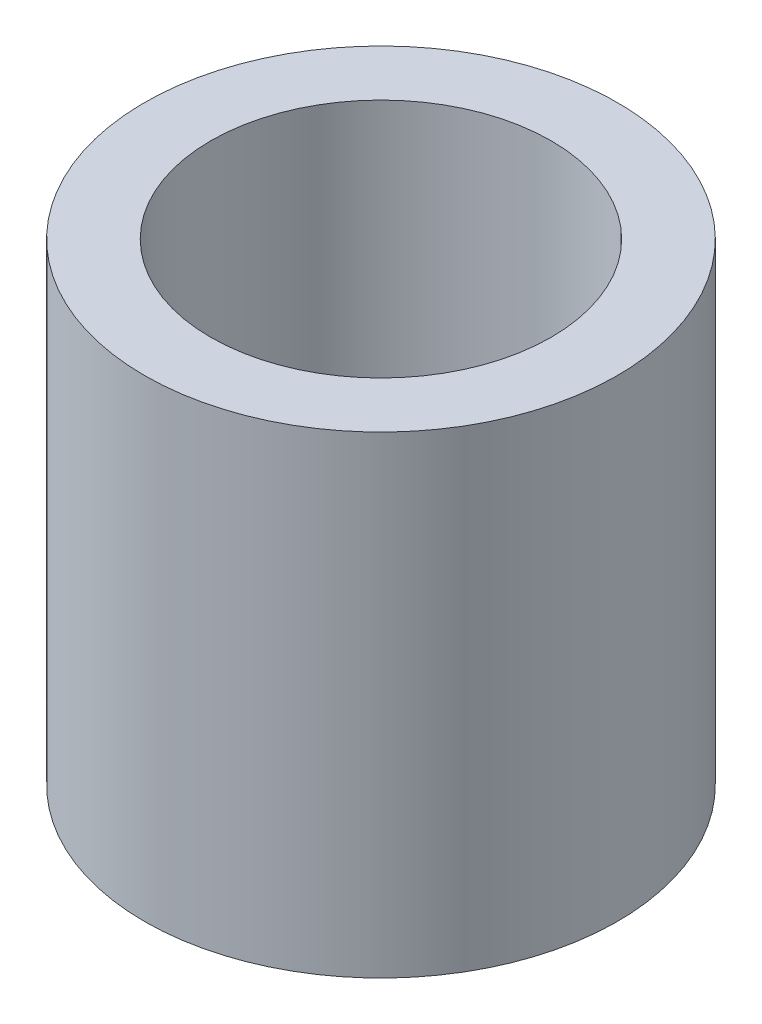
ISO-10303-21;
HEADER;
FILE_DESCRIPTION(('STEP AP214'),'2;1');
FILE_NAME('part.step','',(''),(''),'','','');
FILE_SCHEMA(('AUTOMOTIVE_DESIGN { 1 0 10303 214 1 1 1 1 }'));
ENDSEC;
DATA;
#1=APPLICATION_CONTEXT('core data for automotive mechanical design processes');
#2=APPLICATION_PROTOCOL_DEFINITION('international standard','automotive_design',2000,#1);
#3=PRODUCT_CONTEXT('',#1,'mechanical');
#4=PRODUCT('Part','Part','',(#3));
#5=PRODUCT_RELATED_PRODUCT_CATEGORY('part','',(#4));
#6=PRODUCT_DEFINITION_FORMATION('','',#4);
#7=PRODUCT_DEFINITION_CONTEXT('part definition',#1,'design');
#8=PRODUCT_DEFINITION('design','',#6,#7);
#9=PRODUCT_DEFINITION_SHAPE('','',#8);
#10=(LENGTH_UNIT() NAMED_UNIT(*) SI_UNIT(.MILLI.,.METRE.));
#11=(NAMED_UNIT(*) PLANE_ANGLE_UNIT() SI_UNIT($,.RADIAN.));
#12=(NAMED_UNIT(*) SI_UNIT($,.STERADIAN.) SOLID_ANGLE_UNIT());
#13=UNCERTAINTY_MEASURE_WITH_UNIT(LENGTH_MEASURE(1.E-05),#10,'distance_accuracy_value','');
#14=(GEOMETRIC_REPRESENTATION_CONTEXT(3) GLOBAL_UNCERTAINTY_ASSIGNED_CONTEXT((#13)) GLOBAL_UNIT_ASSIGNED_CONTEXT((#10,
#11,#12)) REPRESENTATION_CONTEXT('',''));
#15=CARTESIAN_POINT('',(0.,0.,0.));
#16=DIRECTION('',(0.,0.,1.));
#17=DIRECTION('',(1.,0.,0.));
#18=AXIS2_PLACEMENT_3D('',#15,#16,#17);
#19=CARTESIAN_POINT('',(0.,25.,0.));
#20=DIRECTION('',(0.,1.,0.));
#21=DIRECTION('',(0.,0.,1.));
#22=AXIS2_PLACEMENT_3D('',#19,#20,#21);
#23=PLANE('',#22);
#24=CARTESIAN_POINT('',(0.,25.,0.));
#25=DIRECTION('',(0.,1.,0.));
#26=DIRECTION('',(0.,0.,1.));
#27=AXIS2_PLACEMENT_3D('',#24,#25,#26);
#28=CIRCLE('',#27,12.5);
#29=CARTESIAN_POINT('',(0.,25.,12.5));
#30=VERTEX_POINT('',#29);
#31=EDGE_CURVE('E10',#30,#30,#28,.T.);
#32=ORIENTED_EDGE('',*,*,#31,.T.);
#33=EDGE_LOOP('',(#32));
#34=FACE_BOUND('',#33,.T.);
#35=CARTESIAN_POINT('',(0.,25.,0.));
#36=DIRECTION('',(0.,1.,0.));
#37=DIRECTION('',(0.,0.,1.));
#38=AXIS2_PLACEMENT_3D('',#35,#36,#37);
#39=CIRCLE('',#38,9.);
#40=CARTESIAN_POINT('',(0.,25.,9.));
#41=VERTEX_POINT('',#40);
#42=EDGE_CURVE('E41',#41,#41,#39,.T.);
#43=ORIENTED_EDGE('',*,*,#42,.F.);
#44=EDGE_LOOP('',(#43));
#45=FACE_BOUND('',#44,.T.);
#46=ADVANCED_FACE('F30',(#34,#45),#23,.T.);
#47=CARTESIAN_POINT('',(0.,0.,0.));
#48=DIRECTION('',(0.,1.,0.));
#49=DIRECTION('',(0.,0.,1.));
#50=AXIS2_PLACEMENT_3D('',#47,#48,#49);
#51=PLANE('',#50);
#52=CARTESIAN_POINT('',(0.,0.,0.));
#53=DIRECTION('',(0.,1.,0.));
#54=DIRECTION('',(0.,0.,1.));
#55=AXIS2_PLACEMENT_3D('',#52,#53,#54);
#56=CIRCLE('',#55,12.5);
#57=CARTESIAN_POINT('',(0.,0.,12.5));
#58=VERTEX_POINT('',#57);
#59=EDGE_CURVE('E34',#58,#58,#56,.T.);
#60=ORIENTED_EDGE('',*,*,#59,.F.);
#61=EDGE_LOOP('',(#60));
#62=FACE_BOUND('',#61,.T.);
#63=CARTESIAN_POINT('',(0.,0.,0.));
#64=DIRECTION('',(0.,1.,0.));
#65=DIRECTION('',(0.,0.,1.));
#66=AXIS2_PLACEMENT_3D('',#63,#64,#65);
#67=CIRCLE('',#66,9.);
#68=CARTESIAN_POINT('',(0.,0.,9.));
#69=VERTEX_POINT('',#68);
#70=EDGE_CURVE('E43',#69,#69,#67,.T.);
#71=ORIENTED_EDGE('',*,*,#70,.T.);
#72=EDGE_LOOP('',(#71));
#73=FACE_BOUND('',#72,.T.);
#74=ADVANCED_FACE('F53',(#62,#73),#51,.F.);
#75=CARTESIAN_POINT('',(0.,25.,0.));
#76=DIRECTION('',(0.,-1.,0.));
#77=DIRECTION('',(0.,0.,-1.));
#78=AXIS2_PLACEMENT_3D('',#75,#76,#77);
#79=CYLINDRICAL_SURFACE('',#78,12.5);
#80=ORIENTED_EDGE('',*,*,#31,.F.);
#81=EDGE_LOOP('',(#80));
#82=FACE_BOUND('',#81,.T.);
#83=ORIENTED_EDGE('',*,*,#59,.T.);
#84=EDGE_LOOP('',(#83));
#85=FACE_BOUND('',#84,.T.);
#86=ADVANCED_FACE('F32',(#82,#85),#79,.T.);
#87=CARTESIAN_POINT('',(0.,25.,0.));
#88=DIRECTION('',(0.,-1.,0.));
#89=DIRECTION('',(0.,0.,-1.));
#90=AXIS2_PLACEMENT_3D('',#87,#88,#89);
#91=CYLINDRICAL_SURFACE('',#90,9.);
#92=ORIENTED_EDGE('',*,*,#42,.T.);
#93=EDGE_LOOP('',(#92));
#94=FACE_BOUND('',#93,.T.);
#95=ORIENTED_EDGE('',*,*,#70,.F.);
#96=EDGE_LOOP('',(#95));
#97=FACE_BOUND('',#96,.T.);
#98=ADVANCED_FACE('F49',(#94,#97),#91,.F.);
#99=CLOSED_SHELL('',(#46,#74,#86,#98));
#100=MANIFOLD_SOLID_BREP('B2',#99);
#101=ADVANCED_BREP_SHAPE_REPRESENTATION('',(#18,#100),#14);
#102=SHAPE_DEFINITION_REPRESENTATION(#9,#101);
ENDSEC;
END-ISO-10303-21;
